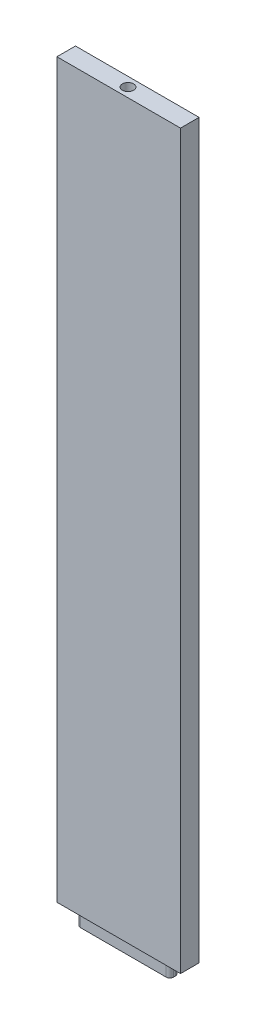
ISO-10303-21;
HEADER;
FILE_DESCRIPTION(('STEP AP214'),'2;1');
FILE_NAME('part.step','',(''),(''),'','','');
FILE_SCHEMA(('AUTOMOTIVE_DESIGN { 1 0 10303 214 1 1 1 1 }'));
ENDSEC;
DATA;
#1=APPLICATION_CONTEXT('core data for automotive mechanical design processes');
#2=APPLICATION_PROTOCOL_DEFINITION('international standard','automotive_design',2000,#1);
#3=PRODUCT_CONTEXT('',#1,'mechanical');
#4=PRODUCT('Part','Part','',(#3));
#5=PRODUCT_RELATED_PRODUCT_CATEGORY('part','',(#4));
#6=PRODUCT_DEFINITION_FORMATION('','',#4);
#7=PRODUCT_DEFINITION_CONTEXT('part definition',#1,'design');
#8=PRODUCT_DEFINITION('design','',#6,#7);
#9=PRODUCT_DEFINITION_SHAPE('','',#8);
#10=(LENGTH_UNIT() NAMED_UNIT(*) SI_UNIT(.MILLI.,.METRE.));
#11=(NAMED_UNIT(*) PLANE_ANGLE_UNIT() SI_UNIT($,.RADIAN.));
#12=(NAMED_UNIT(*) SI_UNIT($,.STERADIAN.) SOLID_ANGLE_UNIT());
#13=UNCERTAINTY_MEASURE_WITH_UNIT(LENGTH_MEASURE(1.E-05),#10,'distance_accuracy_value','');
#14=(GEOMETRIC_REPRESENTATION_CONTEXT(3) GLOBAL_UNCERTAINTY_ASSIGNED_CONTEXT((#13)) GLOBAL_UNIT_ASSIGNED_CONTEXT((#10,
#11,#12)) REPRESENTATION_CONTEXT('',''));
#15=CARTESIAN_POINT('',(0.,0.,0.));
#16=DIRECTION('',(0.,0.,1.));
#17=DIRECTION('',(1.,0.,0.));
#18=AXIS2_PLACEMENT_3D('',#15,#16,#17);
#19=CARTESIAN_POINT('',(16.625,-98.5,5.));
#20=DIRECTION('',(0.,1.,0.));
#21=DIRECTION('',(-1.,0.,0.));
#22=AXIS2_PLACEMENT_3D('',#19,#20,#21);
#23=PLANE('',#22);
#24=DIRECTION('',(1.,0.,0.));
#25=VECTOR('',#24,1.);
#26=CARTESIAN_POINT('',(16.625,-98.5,0.));
#27=LINE('',#26,#25);
#28=CARTESIAN_POINT('',(-16.625,-98.5,0.));
#29=VERTEX_POINT('',#28);
#30=CARTESIAN_POINT('',(16.625,-98.5,0.));
#31=VERTEX_POINT('',#30);
#32=EDGE_CURVE('E273',#29,#31,#27,.T.);
#33=ORIENTED_EDGE('',*,*,#32,.T.);
#34=DIRECTION('',(0.,0.,-1.));
#35=VECTOR('',#34,1.);
#36=CARTESIAN_POINT('',(16.625,-98.5,5.));
#37=LINE('',#36,#35);
#38=CARTESIAN_POINT('',(16.625,-98.5,5.));
#39=VERTEX_POINT('',#38);
#40=EDGE_CURVE('E140',#39,#31,#37,.T.);
#41=ORIENTED_EDGE('',*,*,#40,.F.);
#42=DIRECTION('',(1.,0.,0.));
#43=VECTOR('',#42,1.);
#44=CARTESIAN_POINT('',(16.625,-98.5,5.));
#45=LINE('',#44,#43);
#46=CARTESIAN_POINT('',(-16.625,-98.5,5.));
#47=VERTEX_POINT('',#46);
#48=EDGE_CURVE('E134',#47,#39,#45,.T.);
#49=ORIENTED_EDGE('',*,*,#48,.F.);
#50=DIRECTION('',(0.,0.,-1.));
#51=VECTOR('',#50,1.);
#52=CARTESIAN_POINT('',(-16.625,-98.5,5.));
#53=LINE('',#52,#51);
#54=EDGE_CURVE('E137',#47,#29,#53,.T.);
#55=ORIENTED_EDGE('',*,*,#54,.T.);
#56=EDGE_LOOP('',(#33,#41,#49,#55));
#57=FACE_BOUND('',#56,.T.);
#58=DIRECTION('',(0.,0.,-1.));
#59=VECTOR('',#58,1.);
#60=CARTESIAN_POINT('',(-12.5,-98.5,3.75));
#61=LINE('',#60,#59);
#62=CARTESIAN_POINT('',(-12.5,-98.5,2.75));
#63=VERTEX_POINT('',#62);
#64=CARTESIAN_POINT('',(-12.5,-98.5,2.25));
#65=VERTEX_POINT('',#64);
#66=EDGE_CURVE('E215',#63,#65,#61,.T.);
#67=ORIENTED_EDGE('',*,*,#66,.F.);
#68=CARTESIAN_POINT('',(-11.5,-98.5,2.75));
#69=DIRECTION('',(0.,1.,0.));
#70=DIRECTION('',(-1.,0.,0.));
#71=AXIS2_PLACEMENT_3D('',#68,#69,#70);
#72=CIRCLE('',#71,1.);
#73=CARTESIAN_POINT('',(-11.5,-98.5,3.75));
#74=VERTEX_POINT('',#73);
#75=EDGE_CURVE('E54',#63,#74,#72,.T.);
#76=ORIENTED_EDGE('',*,*,#75,.T.);
#77=DIRECTION('',(-1.,0.,0.));
#78=VECTOR('',#77,1.);
#79=CARTESIAN_POINT('',(12.5,-98.5,3.75));
#80=LINE('',#79,#78);
#81=CARTESIAN_POINT('',(11.5,-98.5,3.75));
#82=VERTEX_POINT('',#81);
#83=EDGE_CURVE('E214',#82,#74,#80,.T.);
#84=ORIENTED_EDGE('',*,*,#83,.F.);
#85=CARTESIAN_POINT('',(11.5,-98.5,2.75));
#86=DIRECTION('',(0.,1.,0.));
#87=DIRECTION('',(-1.,0.,0.));
#88=AXIS2_PLACEMENT_3D('',#85,#86,#87);
#89=CIRCLE('',#88,1.);
#90=CARTESIAN_POINT('',(12.5,-98.5,2.75));
#91=VERTEX_POINT('',#90);
#92=EDGE_CURVE('E209',#82,#91,#89,.T.);
#93=ORIENTED_EDGE('',*,*,#92,.T.);
#94=DIRECTION('',(0.,0.,1.));
#95=VECTOR('',#94,1.);
#96=CARTESIAN_POINT('',(12.5,-98.5,3.75));
#97=LINE('',#96,#95);
#98=CARTESIAN_POINT('',(12.5,-98.5,2.25));
#99=VERTEX_POINT('',#98);
#100=EDGE_CURVE('E223',#99,#91,#97,.T.);
#101=ORIENTED_EDGE('',*,*,#100,.F.);
#102=CARTESIAN_POINT('',(11.5,-98.5,2.25));
#103=DIRECTION('',(0.,1.,0.));
#104=DIRECTION('',(-1.,0.,0.));
#105=AXIS2_PLACEMENT_3D('',#102,#103,#104);
#106=CIRCLE('',#105,1.);
#107=CARTESIAN_POINT('',(11.5,-98.5,1.25));
#108=VERTEX_POINT('',#107);
#109=EDGE_CURVE('E206',#99,#108,#106,.T.);
#110=ORIENTED_EDGE('',*,*,#109,.T.);
#111=DIRECTION('',(1.,0.,0.));
#112=VECTOR('',#111,1.);
#113=CARTESIAN_POINT('',(12.5,-98.5,1.25));
#114=LINE('',#113,#112);
#115=CARTESIAN_POINT('',(-11.5,-98.5,1.25));
#116=VERTEX_POINT('',#115);
#117=EDGE_CURVE('E252',#116,#108,#114,.T.);
#118=ORIENTED_EDGE('',*,*,#117,.F.);
#119=CARTESIAN_POINT('',(-11.5,-98.5,2.25));
#120=DIRECTION('',(0.,1.,0.));
#121=DIRECTION('',(-1.,0.,0.));
#122=AXIS2_PLACEMENT_3D('',#119,#120,#121);
#123=CIRCLE('',#122,1.);
#124=EDGE_CURVE('E11',#116,#65,#123,.T.);
#125=ORIENTED_EDGE('',*,*,#124,.T.);
#126=EDGE_LOOP('',(#67,#76,#84,#93,#101,#110,#118,#125));
#127=FACE_BOUND('',#126,.T.);
#128=ADVANCED_FACE('F45',(#57,#127),#23,.F.);
#129=CARTESIAN_POINT('',(-16.625,98.5,5.));
#130=DIRECTION('',(1.,0.,0.));
#131=DIRECTION('',(0.,1.,0.));
#132=AXIS2_PLACEMENT_3D('',#129,#130,#131);
#133=PLANE('',#132);
#134=DIRECTION('',(0.,-1.,0.));
#135=VECTOR('',#134,1.);
#136=CARTESIAN_POINT('',(-16.625,98.5,0.));
#137=LINE('',#136,#135);
#138=CARTESIAN_POINT('',(-16.625,98.5,0.));
#139=VERTEX_POINT('',#138);
#140=EDGE_CURVE('E159',#139,#29,#137,.T.);
#141=ORIENTED_EDGE('',*,*,#140,.T.);
#142=ORIENTED_EDGE('',*,*,#54,.F.);
#143=DIRECTION('',(0.,-1.,0.));
#144=VECTOR('',#143,1.);
#145=CARTESIAN_POINT('',(-16.625,98.5,5.));
#146=LINE('',#145,#144);
#147=CARTESIAN_POINT('',(-16.625,98.5,5.));
#148=VERTEX_POINT('',#147);
#149=EDGE_CURVE('E145',#148,#47,#146,.T.);
#150=ORIENTED_EDGE('',*,*,#149,.F.);
#151=DIRECTION('',(0.,0.,-1.));
#152=VECTOR('',#151,1.);
#153=CARTESIAN_POINT('',(-16.625,98.5,5.));
#154=LINE('',#153,#152);
#155=EDGE_CURVE('E270',#148,#139,#154,.T.);
#156=ORIENTED_EDGE('',*,*,#155,.T.);
#157=EDGE_LOOP('',(#141,#142,#150,#156));
#158=FACE_BOUND('',#157,.T.);
#159=ADVANCED_FACE('F157',(#158),#133,.F.);
#160=CARTESIAN_POINT('',(16.625,98.5,5.));
#161=DIRECTION('',(-1.,0.,0.));
#162=DIRECTION('',(0.,-1.,0.));
#163=AXIS2_PLACEMENT_3D('',#160,#161,#162);
#164=PLANE('',#163);
#165=DIRECTION('',(0.,1.,0.));
#166=VECTOR('',#165,1.);
#167=CARTESIAN_POINT('',(16.625,98.5,0.));
#168=LINE('',#167,#166);
#169=CARTESIAN_POINT('',(16.625,98.5,0.));
#170=VERTEX_POINT('',#169);
#171=EDGE_CURVE('E276',#31,#170,#168,.T.);
#172=ORIENTED_EDGE('',*,*,#171,.T.);
#173=DIRECTION('',(0.,0.,-1.));
#174=VECTOR('',#173,1.);
#175=CARTESIAN_POINT('',(16.625,98.5,5.));
#176=LINE('',#175,#174);
#177=CARTESIAN_POINT('',(16.625,98.5,5.));
#178=VERTEX_POINT('',#177);
#179=EDGE_CURVE('E167',#178,#170,#176,.T.);
#180=ORIENTED_EDGE('',*,*,#179,.F.);
#181=DIRECTION('',(0.,1.,0.));
#182=VECTOR('',#181,1.);
#183=CARTESIAN_POINT('',(16.625,98.5,5.));
#184=LINE('',#183,#182);
#185=EDGE_CURVE('E144',#39,#178,#184,.T.);
#186=ORIENTED_EDGE('',*,*,#185,.F.);
#187=ORIENTED_EDGE('',*,*,#40,.T.);
#188=EDGE_LOOP('',(#172,#180,#186,#187));
#189=FACE_BOUND('',#188,.T.);
#190=ADVANCED_FACE('F292',(#189),#164,.F.);
#191=CARTESIAN_POINT('',(16.625,98.5,5.));
#192=DIRECTION('',(0.,-1.,0.));
#193=DIRECTION('',(1.,0.,0.));
#194=AXIS2_PLACEMENT_3D('',#191,#192,#193);
#195=PLANE('',#194);
#196=CARTESIAN_POINT('',(0.,98.5,2.5));
#197=DIRECTION('',(0.,1.,0.));
#198=DIRECTION('',(-1.,0.,0.));
#199=AXIS2_PLACEMENT_3D('',#196,#197,#198);
#200=CIRCLE('',#199,1.5);
#201=CARTESIAN_POINT('',(-1.5,98.5,2.5));
#202=VERTEX_POINT('',#201);
#203=EDGE_CURVE('E249',#202,#202,#200,.T.);
#204=ORIENTED_EDGE('',*,*,#203,.F.);
#205=EDGE_LOOP('',(#204));
#206=FACE_BOUND('',#205,.T.);
#207=DIRECTION('',(-1.,0.,0.));
#208=VECTOR('',#207,1.);
#209=CARTESIAN_POINT('',(16.625,98.5,0.));
#210=LINE('',#209,#208);
#211=EDGE_CURVE('E155',#170,#139,#210,.T.);
#212=ORIENTED_EDGE('',*,*,#211,.T.);
#213=ORIENTED_EDGE('',*,*,#155,.F.);
#214=DIRECTION('',(-1.,0.,0.));
#215=VECTOR('',#214,1.);
#216=CARTESIAN_POINT('',(16.625,98.5,5.));
#217=LINE('',#216,#215);
#218=EDGE_CURVE('E150',#178,#148,#217,.T.);
#219=ORIENTED_EDGE('',*,*,#218,.F.);
#220=ORIENTED_EDGE('',*,*,#179,.T.);
#221=EDGE_LOOP('',(#212,#213,#219,#220));
#222=FACE_BOUND('',#221,.T.);
#223=ADVANCED_FACE('F287',(#206,#222),#195,.F.);
#224=CARTESIAN_POINT('',(0.,0.,5.));
#225=DIRECTION('',(0.,0.,-1.));
#226=DIRECTION('',(-1.,0.,0.));
#227=AXIS2_PLACEMENT_3D('',#224,#225,#226);
#228=PLANE('',#227);
#229=ORIENTED_EDGE('',*,*,#149,.T.);
#230=ORIENTED_EDGE('',*,*,#48,.T.);
#231=ORIENTED_EDGE('',*,*,#185,.T.);
#232=ORIENTED_EDGE('',*,*,#218,.T.);
#233=EDGE_LOOP('',(#229,#230,#231,#232));
#234=FACE_BOUND('',#233,.T.);
#235=ADVANCED_FACE('F148',(#234),#228,.F.);
#236=CARTESIAN_POINT('',(0.,0.,0.));
#237=DIRECTION('',(0.,0.,-1.));
#238=DIRECTION('',(-1.,0.,0.));
#239=AXIS2_PLACEMENT_3D('',#236,#237,#238);
#240=PLANE('',#239);
#241=ORIENTED_EDGE('',*,*,#140,.F.);
#242=ORIENTED_EDGE('',*,*,#211,.F.);
#243=ORIENTED_EDGE('',*,*,#171,.F.);
#244=ORIENTED_EDGE('',*,*,#32,.F.);
#245=EDGE_LOOP('',(#241,#242,#243,#244));
#246=FACE_BOUND('',#245,.T.);
#247=ADVANCED_FACE('F291',(#246),#240,.T.);
#248=CARTESIAN_POINT('',(0.,83.5,2.5));
#249=DIRECTION('',(0.,1.,0.));
#250=DIRECTION('',(-1.,0.,0.));
#251=AXIS2_PLACEMENT_3D('',#248,#249,#250);
#252=CYLINDRICAL_SURFACE('',#251,1.5);
#253=CARTESIAN_POINT('',(0.,83.5,2.5));
#254=DIRECTION('',(0.,1.,0.));
#255=DIRECTION('',(-1.,0.,0.));
#256=AXIS2_PLACEMENT_3D('',#253,#254,#255);
#257=CIRCLE('',#256,1.5);
#258=CARTESIAN_POINT('',(-1.49999999999999,83.5,2.5));
#259=VERTEX_POINT('',#258);
#260=EDGE_CURVE('E259',#259,#259,#257,.T.);
#261=ORIENTED_EDGE('',*,*,#260,.F.);
#262=EDGE_LOOP('',(#261));
#263=FACE_BOUND('',#262,.T.);
#264=ORIENTED_EDGE('',*,*,#203,.T.);
#265=EDGE_LOOP('',(#264));
#266=FACE_BOUND('',#265,.T.);
#267=ADVANCED_FACE('F350',(#263,#266),#252,.F.);
#268=CARTESIAN_POINT('',(0.,83.5,2.5));
#269=DIRECTION('',(0.,1.,0.));
#270=DIRECTION('',(-1.,0.,0.));
#271=AXIS2_PLACEMENT_3D('',#268,#269,#270);
#272=PLANE('',#271);
#273=ORIENTED_EDGE('',*,*,#260,.T.);
#274=EDGE_LOOP('',(#273));
#275=FACE_BOUND('',#274,.T.);
#276=ADVANCED_FACE('F348',(#275),#272,.T.);
#277=CARTESIAN_POINT('',(-12.5,-102.5,3.75));
#278=DIRECTION('',(1.,0.,0.));
#279=DIRECTION('',(0.,1.,0.));
#280=AXIS2_PLACEMENT_3D('',#277,#278,#279);
#281=PLANE('',#280);
#282=DIRECTION('',(0.,0.,-1.));
#283=VECTOR('',#282,1.);
#284=CARTESIAN_POINT('',(-12.5,-102.5,3.75));
#285=LINE('',#284,#283);
#286=CARTESIAN_POINT('',(-12.5,-102.5,2.75));
#287=VERTEX_POINT('',#286);
#288=CARTESIAN_POINT('',(-12.5,-102.5,2.25));
#289=VERTEX_POINT('',#288);
#290=EDGE_CURVE('E222',#287,#289,#285,.T.);
#291=ORIENTED_EDGE('',*,*,#290,.F.);
#292=DIRECTION('',(0.,1.,0.));
#293=VECTOR('',#292,1.);
#294=CARTESIAN_POINT('',(-12.5,-102.5,2.75));
#295=LINE('',#294,#293);
#296=EDGE_CURVE('E203',#287,#63,#295,.T.);
#297=ORIENTED_EDGE('',*,*,#296,.T.);
#298=ORIENTED_EDGE('',*,*,#66,.T.);
#299=DIRECTION('',(0.,1.,0.));
#300=VECTOR('',#299,1.);
#301=CARTESIAN_POINT('',(-12.5,-102.5,2.25));
#302=LINE('',#301,#300);
#303=EDGE_CURVE('E200',#65,#289,#302,.F.);
#304=ORIENTED_EDGE('',*,*,#303,.T.);
#305=EDGE_LOOP('',(#291,#297,#298,#304));
#306=FACE_BOUND('',#305,.T.);
#307=ADVANCED_FACE('F235',(#306),#281,.F.);
#308=CARTESIAN_POINT('',(12.5,-102.5,1.25));
#309=DIRECTION('',(0.,0.,1.));
#310=DIRECTION('',(1.,0.,0.));
#311=AXIS2_PLACEMENT_3D('',#308,#309,#310);
#312=PLANE('',#311);
#313=ORIENTED_EDGE('',*,*,#117,.T.);
#314=DIRECTION('',(0.,1.,0.));
#315=VECTOR('',#314,1.);
#316=CARTESIAN_POINT('',(11.5,-102.5,1.25));
#317=LINE('',#316,#315);
#318=CARTESIAN_POINT('',(11.5,-102.5,1.25));
#319=VERTEX_POINT('',#318);
#320=EDGE_CURVE('E178',#108,#319,#317,.F.);
#321=ORIENTED_EDGE('',*,*,#320,.T.);
#322=DIRECTION('',(1.,0.,0.));
#323=VECTOR('',#322,1.);
#324=CARTESIAN_POINT('',(12.5,-102.5,1.25));
#325=LINE('',#324,#323);
#326=CARTESIAN_POINT('',(-11.5,-102.5,1.25));
#327=VERTEX_POINT('',#326);
#328=EDGE_CURVE('E238',#327,#319,#325,.T.);
#329=ORIENTED_EDGE('',*,*,#328,.F.);
#330=DIRECTION('',(0.,1.,0.));
#331=VECTOR('',#330,1.);
#332=CARTESIAN_POINT('',(-11.5,-102.5,1.25));
#333=LINE('',#332,#331);
#334=EDGE_CURVE('E174',#327,#116,#333,.T.);
#335=ORIENTED_EDGE('',*,*,#334,.T.);
#336=EDGE_LOOP('',(#313,#321,#329,#335));
#337=FACE_BOUND('',#336,.T.);
#338=ADVANCED_FACE('F328',(#337),#312,.F.);
#339=CARTESIAN_POINT('',(12.5,-102.5,3.75));
#340=DIRECTION('',(-1.,0.,0.));
#341=DIRECTION('',(0.,0.,1.));
#342=AXIS2_PLACEMENT_3D('',#339,#340,#341);
#343=PLANE('',#342);
#344=DIRECTION('',(0.,0.,1.));
#345=VECTOR('',#344,1.);
#346=CARTESIAN_POINT('',(12.5,-102.5,3.75));
#347=LINE('',#346,#345);
#348=CARTESIAN_POINT('',(12.5,-102.5,2.25));
#349=VERTEX_POINT('',#348);
#350=CARTESIAN_POINT('',(12.5,-102.5,2.75));
#351=VERTEX_POINT('',#350);
#352=EDGE_CURVE('E241',#349,#351,#347,.T.);
#353=ORIENTED_EDGE('',*,*,#352,.F.);
#354=DIRECTION('',(0.,1.,0.));
#355=VECTOR('',#354,1.);
#356=CARTESIAN_POINT('',(12.5,-102.5,2.25));
#357=LINE('',#356,#355);
#358=EDGE_CURVE('E165',#349,#99,#357,.T.);
#359=ORIENTED_EDGE('',*,*,#358,.T.);
#360=ORIENTED_EDGE('',*,*,#100,.T.);
#361=DIRECTION('',(0.,1.,0.));
#362=VECTOR('',#361,1.);
#363=CARTESIAN_POINT('',(12.5,-102.5,2.75));
#364=LINE('',#363,#362);
#365=EDGE_CURVE('E161',#91,#351,#364,.F.);
#366=ORIENTED_EDGE('',*,*,#365,.T.);
#367=EDGE_LOOP('',(#353,#359,#360,#366));
#368=FACE_BOUND('',#367,.T.);
#369=ADVANCED_FACE('F334',(#368),#343,.F.);
#370=CARTESIAN_POINT('',(12.5,-102.5,3.75));
#371=DIRECTION('',(0.,0.,-1.));
#372=DIRECTION('',(-1.,0.,0.));
#373=AXIS2_PLACEMENT_3D('',#370,#371,#372);
#374=PLANE('',#373);
#375=DIRECTION('',(-1.,0.,0.));
#376=VECTOR('',#375,1.);
#377=CARTESIAN_POINT('',(12.5,-102.5,3.75));
#378=LINE('',#377,#376);
#379=CARTESIAN_POINT('',(11.5,-102.5,3.75));
#380=VERTEX_POINT('',#379);
#381=CARTESIAN_POINT('',(-11.5,-102.5,3.75));
#382=VERTEX_POINT('',#381);
#383=EDGE_CURVE('E233',#380,#382,#378,.T.);
#384=ORIENTED_EDGE('',*,*,#383,.F.);
#385=DIRECTION('',(0.,1.,0.));
#386=VECTOR('',#385,1.);
#387=CARTESIAN_POINT('',(11.5,-102.5,3.75));
#388=LINE('',#387,#386);
#389=EDGE_CURVE('E196',#380,#82,#388,.T.);
#390=ORIENTED_EDGE('',*,*,#389,.T.);
#391=ORIENTED_EDGE('',*,*,#83,.T.);
#392=DIRECTION('',(0.,1.,0.));
#393=VECTOR('',#392,1.);
#394=CARTESIAN_POINT('',(-11.5,-102.5,3.75));
#395=LINE('',#394,#393);
#396=EDGE_CURVE('E193',#74,#382,#395,.F.);
#397=ORIENTED_EDGE('',*,*,#396,.T.);
#398=EDGE_LOOP('',(#384,#390,#391,#397));
#399=FACE_BOUND('',#398,.T.);
#400=ADVANCED_FACE('F218',(#399),#374,.F.);
#401=CARTESIAN_POINT('',(0.,-102.5,0.));
#402=DIRECTION('',(0.,1.,0.));
#403=DIRECTION('',(0.,0.,1.));
#404=AXIS2_PLACEMENT_3D('',#401,#402,#403);
#405=PLANE('',#404);
#406=ORIENTED_EDGE('',*,*,#328,.T.);
#407=CARTESIAN_POINT('',(11.5,-102.5,2.25));
#408=DIRECTION('',(0.,1.,0.));
#409=DIRECTION('',(0.,0.,1.));
#410=AXIS2_PLACEMENT_3D('',#407,#408,#409);
#411=CIRCLE('',#410,1.);
#412=EDGE_CURVE('E190',#319,#349,#411,.F.);
#413=ORIENTED_EDGE('',*,*,#412,.T.);
#414=ORIENTED_EDGE('',*,*,#352,.T.);
#415=CARTESIAN_POINT('',(11.5,-102.5,2.75));
#416=DIRECTION('',(0.,1.,0.));
#417=DIRECTION('',(0.,0.,1.));
#418=AXIS2_PLACEMENT_3D('',#415,#416,#417);
#419=CIRCLE('',#418,1.);
#420=EDGE_CURVE('E187',#351,#380,#419,.F.);
#421=ORIENTED_EDGE('',*,*,#420,.T.);
#422=ORIENTED_EDGE('',*,*,#383,.T.);
#423=CARTESIAN_POINT('',(-11.5,-102.5,2.75));
#424=DIRECTION('',(0.,1.,0.));
#425=DIRECTION('',(0.,0.,1.));
#426=AXIS2_PLACEMENT_3D('',#423,#424,#425);
#427=CIRCLE('',#426,1.);
#428=EDGE_CURVE('E184',#382,#287,#427,.F.);
#429=ORIENTED_EDGE('',*,*,#428,.T.);
#430=ORIENTED_EDGE('',*,*,#290,.T.);
#431=CARTESIAN_POINT('',(-11.5,-102.5,2.25));
#432=DIRECTION('',(0.,1.,0.));
#433=DIRECTION('',(0.,0.,1.));
#434=AXIS2_PLACEMENT_3D('',#431,#432,#433);
#435=CIRCLE('',#434,1.);
#436=EDGE_CURVE('E181',#289,#327,#435,.F.);
#437=ORIENTED_EDGE('',*,*,#436,.T.);
#438=EDGE_LOOP('',(#406,#413,#414,#421,#422,#429,#430,#437));
#439=FACE_BOUND('',#438,.T.);
#440=ADVANCED_FACE('F231',(#439),#405,.F.);
#441=CARTESIAN_POINT('',(11.5,-102.5,2.25));
#442=DIRECTION('',(0.,1.,0.));
#443=DIRECTION('',(-1.,0.,0.));
#444=AXIS2_PLACEMENT_3D('',#441,#442,#443);
#445=CYLINDRICAL_SURFACE('',#444,1.);
#446=ORIENTED_EDGE('',*,*,#412,.F.);
#447=ORIENTED_EDGE('',*,*,#320,.F.);
#448=ORIENTED_EDGE('',*,*,#109,.F.);
#449=ORIENTED_EDGE('',*,*,#358,.F.);
#450=EDGE_LOOP('',(#446,#447,#448,#449));
#451=FACE_BOUND('',#450,.T.);
#452=ADVANCED_FACE('F310',(#451),#445,.T.);
#453=CARTESIAN_POINT('',(11.5,-102.5,2.75));
#454=DIRECTION('',(0.,1.,0.));
#455=DIRECTION('',(-1.,0.,0.));
#456=AXIS2_PLACEMENT_3D('',#453,#454,#455);
#457=CYLINDRICAL_SURFACE('',#456,1.);
#458=ORIENTED_EDGE('',*,*,#420,.F.);
#459=ORIENTED_EDGE('',*,*,#365,.F.);
#460=ORIENTED_EDGE('',*,*,#92,.F.);
#461=ORIENTED_EDGE('',*,*,#389,.F.);
#462=EDGE_LOOP('',(#458,#459,#460,#461));
#463=FACE_BOUND('',#462,.T.);
#464=ADVANCED_FACE('F313',(#463),#457,.T.);
#465=CARTESIAN_POINT('',(-11.5,-102.5,2.75));
#466=DIRECTION('',(0.,1.,0.));
#467=DIRECTION('',(-1.,0.,0.));
#468=AXIS2_PLACEMENT_3D('',#465,#466,#467);
#469=CYLINDRICAL_SURFACE('',#468,1.);
#470=ORIENTED_EDGE('',*,*,#428,.F.);
#471=ORIENTED_EDGE('',*,*,#396,.F.);
#472=ORIENTED_EDGE('',*,*,#75,.F.);
#473=ORIENTED_EDGE('',*,*,#296,.F.);
#474=EDGE_LOOP('',(#470,#471,#472,#473));
#475=FACE_BOUND('',#474,.T.);
#476=ADVANCED_FACE('F226',(#475),#469,.T.);
#477=CARTESIAN_POINT('',(-11.5,-102.5,2.25));
#478=DIRECTION('',(0.,1.,0.));
#479=DIRECTION('',(-1.,0.,0.));
#480=AXIS2_PLACEMENT_3D('',#477,#478,#479);
#481=CYLINDRICAL_SURFACE('',#480,1.);
#482=ORIENTED_EDGE('',*,*,#436,.F.);
#483=ORIENTED_EDGE('',*,*,#303,.F.);
#484=ORIENTED_EDGE('',*,*,#124,.F.);
#485=ORIENTED_EDGE('',*,*,#334,.F.);
#486=EDGE_LOOP('',(#482,#483,#484,#485));
#487=FACE_BOUND('',#486,.T.);
#488=ADVANCED_FACE('F47',(#487),#481,.T.);
#489=CLOSED_SHELL('',(#128,#159,#190,#223,#235,#247,#267,#276,#307,#338,#369,#400,#440,#452,
#464,#476,#488));
#490=MANIFOLD_SOLID_BREP('B2',#489);
#491=ADVANCED_BREP_SHAPE_REPRESENTATION('',(#18,#490),#14);
#492=SHAPE_DEFINITION_REPRESENTATION(#9,#491);
ENDSEC;
END-ISO-10303-21;
